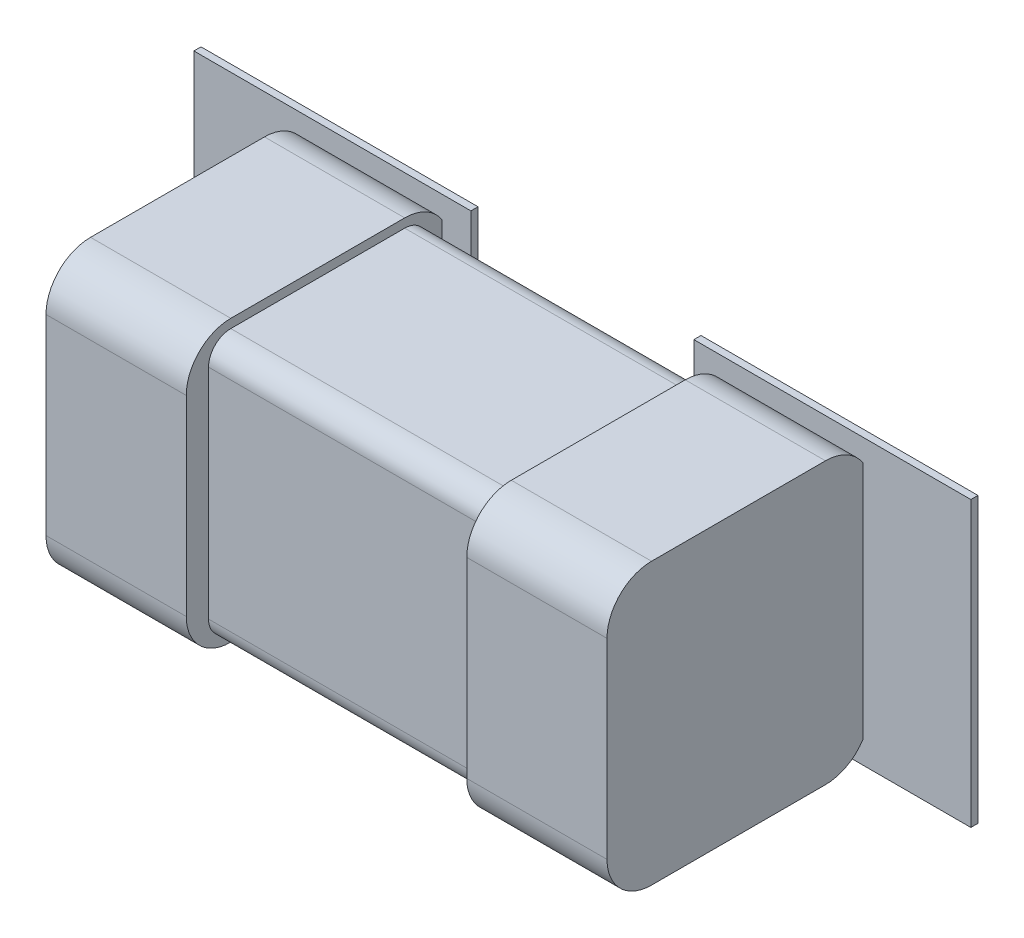
ISO-10303-21;
HEADER;
FILE_DESCRIPTION(('STEP AP214'),'2;1');
FILE_NAME('part.step','',(''),(''),'','','');
FILE_SCHEMA(('AUTOMOTIVE_DESIGN { 1 0 10303 214 1 1 1 1 }'));
ENDSEC;
DATA;
#1=APPLICATION_CONTEXT('core data for automotive mechanical design processes');
#2=APPLICATION_PROTOCOL_DEFINITION('international standard','automotive_design',2000,#1);
#3=PRODUCT_CONTEXT('',#1,'mechanical');
#4=PRODUCT('Part','Part','',(#3));
#5=PRODUCT_RELATED_PRODUCT_CATEGORY('part','',(#4));
#6=PRODUCT_DEFINITION_FORMATION('','',#4);
#7=PRODUCT_DEFINITION_CONTEXT('part definition',#1,'design');
#8=PRODUCT_DEFINITION('design','',#6,#7);
#9=PRODUCT_DEFINITION_SHAPE('','',#8);
#10=(LENGTH_UNIT() NAMED_UNIT(*) SI_UNIT(.MILLI.,.METRE.));
#11=(NAMED_UNIT(*) PLANE_ANGLE_UNIT() SI_UNIT($,.RADIAN.));
#12=(NAMED_UNIT(*) SI_UNIT($,.STERADIAN.) SOLID_ANGLE_UNIT());
#13=UNCERTAINTY_MEASURE_WITH_UNIT(LENGTH_MEASURE(1.E-05),#10,'distance_accuracy_value','');
#14=(GEOMETRIC_REPRESENTATION_CONTEXT(3) GLOBAL_UNCERTAINTY_ASSIGNED_CONTEXT((#13)) GLOBAL_UNIT_ASSIGNED_CONTEXT((#10,
#11,#12)) REPRESENTATION_CONTEXT('',''));
#15=CARTESIAN_POINT('',(0.,0.,0.));
#16=DIRECTION('',(0.,0.,1.));
#17=DIRECTION('',(1.,0.,0.));
#18=AXIS2_PLACEMENT_3D('',#15,#16,#17);
#19=CARTESIAN_POINT('',(0.,0.,0.0762));
#20=DIRECTION('',(0.,0.,1.));
#21=DIRECTION('',(1.,0.,0.));
#22=AXIS2_PLACEMENT_3D('',#19,#20,#21);
#23=PLANE('',#22);
#24=DIRECTION('',(0.,1.,0.));
#25=VECTOR('',#24,1.);
#26=CARTESIAN_POINT('',(-0.318008,-0.405003,0.0762));
#27=LINE('',#26,#25);
#28=CARTESIAN_POINT('',(-0.318008,-0.405003,0.0762));
#29=VERTEX_POINT('',#28);
#30=CARTESIAN_POINT('',(-0.318008,0.405003,0.0762));
#31=VERTEX_POINT('',#30);
#32=EDGE_CURVE('E283',#29,#31,#27,.T.);
#33=ORIENTED_EDGE('',*,*,#32,.F.);
#34=DIRECTION('',(1.,0.,0.));
#35=VECTOR('',#34,1.);
#36=CARTESIAN_POINT('',(-1.1079988,-0.405003,0.0762));
#37=LINE('',#36,#35);
#38=CARTESIAN_POINT('',(-1.1079988,-0.405003,0.0762));
#39=VERTEX_POINT('',#38);
#40=EDGE_CURVE('E288',#39,#29,#37,.T.);
#41=ORIENTED_EDGE('',*,*,#40,.F.);
#42=DIRECTION('',(0.,1.,0.));
#43=VECTOR('',#42,1.);
#44=CARTESIAN_POINT('',(-1.1079988,0.405003,0.0762));
#45=LINE('',#44,#43);
#46=CARTESIAN_POINT('',(-1.1079988,0.405003,0.0762));
#47=VERTEX_POINT('',#46);
#48=EDGE_CURVE('E260',#47,#39,#45,.F.);
#49=ORIENTED_EDGE('',*,*,#48,.F.);
#50=DIRECTION('',(1.,0.,0.));
#51=VECTOR('',#50,1.);
#52=CARTESIAN_POINT('',(-0.318008,0.405003,0.0762));
#53=LINE('',#52,#51);
#54=EDGE_CURVE('E278',#31,#47,#53,.F.);
#55=ORIENTED_EDGE('',*,*,#54,.F.);
#56=EDGE_LOOP('',(#33,#41,#49,#55));
#57=FACE_BOUND('',#56,.T.);
#58=ADVANCED_FACE('F17',(#57),#23,.F.);
#59=CARTESIAN_POINT('',(-1.1079988,-0.405003,0.0762));
#60=DIRECTION('',(0.,-1.,0.));
#61=DIRECTION('',(0.,0.,-1.));
#62=AXIS2_PLACEMENT_3D('',#59,#60,#61);
#63=PLANE('',#62);
#64=DIRECTION('',(0.,0.,1.));
#65=VECTOR('',#64,1.);
#66=CARTESIAN_POINT('',(-1.1079988,-0.405003,0.0762));
#67=LINE('',#66,#65);
#68=CARTESIAN_POINT('',(-1.1079988,-0.405003,0.09652));
#69=VERTEX_POINT('',#68);
#70=EDGE_CURVE('E276',#39,#69,#67,.T.);
#71=ORIENTED_EDGE('',*,*,#70,.F.);
#72=ORIENTED_EDGE('',*,*,#40,.T.);
#73=DIRECTION('',(0.,0.,-1.));
#74=VECTOR('',#73,1.);
#75=CARTESIAN_POINT('',(-0.318008,-0.405003,0.0762));
#76=LINE('',#75,#74);
#77=CARTESIAN_POINT('',(-0.318008,-0.405003,0.09652));
#78=VERTEX_POINT('',#77);
#79=EDGE_CURVE('E285',#78,#29,#76,.T.);
#80=ORIENTED_EDGE('',*,*,#79,.F.);
#81=DIRECTION('',(1.,0.,0.));
#82=VECTOR('',#81,1.);
#83=CARTESIAN_POINT('',(0.,-0.405003,0.09652));
#84=LINE('',#83,#82);
#85=EDGE_CURVE('E259',#69,#78,#84,.T.);
#86=ORIENTED_EDGE('',*,*,#85,.F.);
#87=EDGE_LOOP('',(#71,#72,#80,#86));
#88=FACE_BOUND('',#87,.T.);
#89=ADVANCED_FACE('F916',(#88),#63,.T.);
#90=CARTESIAN_POINT('',(-0.318008,-0.405003,0.0762));
#91=DIRECTION('',(1.,0.,0.));
#92=DIRECTION('',(0.,0.,-1.));
#93=AXIS2_PLACEMENT_3D('',#90,#91,#92);
#94=PLANE('',#93);
#95=ORIENTED_EDGE('',*,*,#79,.T.);
#96=ORIENTED_EDGE('',*,*,#32,.T.);
#97=DIRECTION('',(0.,0.,1.));
#98=VECTOR('',#97,1.);
#99=CARTESIAN_POINT('',(-0.318008,0.405003,0.0762));
#100=LINE('',#99,#98);
#101=CARTESIAN_POINT('',(-0.318008,0.405003,0.09652));
#102=VERTEX_POINT('',#101);
#103=EDGE_CURVE('E280',#102,#31,#100,.F.);
#104=ORIENTED_EDGE('',*,*,#103,.F.);
#105=DIRECTION('',(0.,1.,0.));
#106=VECTOR('',#105,1.);
#107=CARTESIAN_POINT('',(-0.318008,0.,0.09652));
#108=LINE('',#107,#106);
#109=EDGE_CURVE('E257',#78,#102,#108,.T.);
#110=ORIENTED_EDGE('',*,*,#109,.F.);
#111=EDGE_LOOP('',(#95,#96,#104,#110));
#112=FACE_BOUND('',#111,.T.);
#113=ADVANCED_FACE('F907',(#112),#94,.T.);
#114=CARTESIAN_POINT('',(-0.318008,0.405003,0.0762));
#115=DIRECTION('',(0.,1.,0.));
#116=DIRECTION('',(0.,0.,1.));
#117=AXIS2_PLACEMENT_3D('',#114,#115,#116);
#118=PLANE('',#117);
#119=ORIENTED_EDGE('',*,*,#103,.T.);
#120=ORIENTED_EDGE('',*,*,#54,.T.);
#121=DIRECTION('',(0.,0.,1.));
#122=VECTOR('',#121,1.);
#123=CARTESIAN_POINT('',(-1.1079988,0.405003,0.0762));
#124=LINE('',#123,#122);
#125=CARTESIAN_POINT('',(-1.1079988,0.405003,0.09652));
#126=VERTEX_POINT('',#125);
#127=EDGE_CURVE('E273',#126,#47,#124,.F.);
#128=ORIENTED_EDGE('',*,*,#127,.F.);
#129=DIRECTION('',(1.,0.,0.));
#130=VECTOR('',#129,1.);
#131=CARTESIAN_POINT('',(0.,0.405003,0.09652));
#132=LINE('',#131,#130);
#133=EDGE_CURVE('E255',#102,#126,#132,.F.);
#134=ORIENTED_EDGE('',*,*,#133,.F.);
#135=EDGE_LOOP('',(#119,#120,#128,#134));
#136=FACE_BOUND('',#135,.T.);
#137=ADVANCED_FACE('F898',(#136),#118,.T.);
#138=CARTESIAN_POINT('',(-1.1079988,0.405003,0.0762));
#139=DIRECTION('',(-1.,0.,0.));
#140=DIRECTION('',(0.,0.,1.));
#141=AXIS2_PLACEMENT_3D('',#138,#139,#140);
#142=PLANE('',#141);
#143=ORIENTED_EDGE('',*,*,#127,.T.);
#144=ORIENTED_EDGE('',*,*,#48,.T.);
#145=ORIENTED_EDGE('',*,*,#70,.T.);
#146=DIRECTION('',(0.,1.,0.));
#147=VECTOR('',#146,1.);
#148=CARTESIAN_POINT('',(-1.1079988,0.,0.09652));
#149=LINE('',#148,#147);
#150=EDGE_CURVE('E238',#126,#69,#149,.F.);
#151=ORIENTED_EDGE('',*,*,#150,.F.);
#152=EDGE_LOOP('',(#143,#144,#145,#151));
#153=FACE_BOUND('',#152,.T.);
#154=ADVANCED_FACE('F889',(#153),#142,.T.);
#155=CARTESIAN_POINT('',(-0.800000000000102,0.399999999999924,0.0762));
#156=DIRECTION('',(-1.,0.,0.));
#157=DIRECTION('',(0.,0.,1.));
#158=AXIS2_PLACEMENT_3D('',#155,#156,#157);
#159=PLANE('',#158);
#160=CARTESIAN_POINT('',(-0.800000000000102,0.272999999999924,0.2032));
#161=DIRECTION('',(1.,0.,0.));
#162=DIRECTION('',(0.,0.,-1.));
#163=AXIS2_PLACEMENT_3D('',#160,#161,#162);
#164=CIRCLE('',#163,0.127);
#165=CARTESIAN_POINT('',(-0.800000000000102,0.341908472628476,0.0965199999999994));
#166=VERTEX_POINT('',#165);
#167=CARTESIAN_POINT('',(-0.800000000000102,0.399999999999924,0.2032));
#168=VERTEX_POINT('',#167);
#169=EDGE_CURVE('E232',#166,#168,#164,.T.);
#170=ORIENTED_EDGE('',*,*,#169,.F.);
#171=DIRECTION('',(0.,1.,0.));
#172=VECTOR('',#171,1.);
#173=CARTESIAN_POINT('',(-0.800000000000102,0.,0.09652));
#174=LINE('',#173,#172);
#175=CARTESIAN_POINT('',(-0.800000000000102,-0.341908472628476,0.0965199999999994));
#176=VERTEX_POINT('',#175);
#177=EDGE_CURVE('E227',#176,#166,#174,.T.);
#178=ORIENTED_EDGE('',*,*,#177,.F.);
#179=CARTESIAN_POINT('',(-0.800000000000102,-0.272999999999924,0.2032));
#180=DIRECTION('',(1.,0.,0.));
#181=DIRECTION('',(0.,0.,-1.));
#182=AXIS2_PLACEMENT_3D('',#179,#180,#181);
#183=CIRCLE('',#182,0.127);
#184=CARTESIAN_POINT('',(-0.800000000000102,-0.399999999999924,0.2032));
#185=VERTEX_POINT('',#184);
#186=EDGE_CURVE('E20',#185,#176,#183,.T.);
#187=ORIENTED_EDGE('',*,*,#186,.F.);
#188=DIRECTION('',(0.,0.,-1.));
#189=VECTOR('',#188,1.);
#190=CARTESIAN_POINT('',(-0.800000000000102,-0.399999999999924,0.0762));
#191=LINE('',#190,#189);
#192=CARTESIAN_POINT('',(-0.800000000000102,-0.399999999999924,0.699262));
#193=VERTEX_POINT('',#192);
#194=EDGE_CURVE('E222',#193,#185,#191,.T.);
#195=ORIENTED_EDGE('',*,*,#194,.F.);
#196=CARTESIAN_POINT('',(-0.800000000000102,-0.272999999999924,0.699262));
#197=DIRECTION('',(1.,0.,0.));
#198=DIRECTION('',(0.,0.,-1.));
#199=AXIS2_PLACEMENT_3D('',#196,#197,#198);
#200=CIRCLE('',#199,0.127);
#201=CARTESIAN_POINT('',(-0.800000000000102,-0.272999999999924,0.826262));
#202=VERTEX_POINT('',#201);
#203=EDGE_CURVE('E369',#202,#193,#200,.T.);
#204=ORIENTED_EDGE('',*,*,#203,.F.);
#205=DIRECTION('',(0.,1.,0.));
#206=VECTOR('',#205,1.);
#207=CARTESIAN_POINT('',(-0.800000000000102,0.,0.826262));
#208=LINE('',#207,#206);
#209=CARTESIAN_POINT('',(-0.800000000000102,0.272999999999924,0.826262));
#210=VERTEX_POINT('',#209);
#211=EDGE_CURVE('E266',#210,#202,#208,.F.);
#212=ORIENTED_EDGE('',*,*,#211,.F.);
#213=CARTESIAN_POINT('',(-0.800000000000102,0.272999999999924,0.699262));
#214=DIRECTION('',(-1.,0.,0.));
#215=DIRECTION('',(0.,0.,1.));
#216=AXIS2_PLACEMENT_3D('',#213,#214,#215);
#217=CIRCLE('',#216,0.127);
#218=CARTESIAN_POINT('',(-0.800000000000102,0.399999999999924,0.699262));
#219=VERTEX_POINT('',#218);
#220=EDGE_CURVE('E265',#219,#210,#217,.F.);
#221=ORIENTED_EDGE('',*,*,#220,.F.);
#222=DIRECTION('',(0.,0.,1.));
#223=VECTOR('',#222,1.);
#224=CARTESIAN_POINT('',(-0.800000000000102,0.399999999999924,0.0762));
#225=LINE('',#224,#223);
#226=EDGE_CURVE('E262',#168,#219,#225,.T.);
#227=ORIENTED_EDGE('',*,*,#226,.F.);
#228=EDGE_LOOP('',(#170,#178,#187,#195,#204,#212,#221,#227));
#229=FACE_BOUND('',#228,.T.);
#230=ADVANCED_FACE('F229',(#229),#159,.T.);
#231=CARTESIAN_POINT('',(0.,0.,0.09652));
#232=DIRECTION('',(0.,0.,1.));
#233=DIRECTION('',(1.,0.,0.));
#234=AXIS2_PLACEMENT_3D('',#231,#232,#233);
#235=PLANE('',#234);
#236=DIRECTION('',(1.,0.,0.));
#237=VECTOR('',#236,1.);
#238=CARTESIAN_POINT('',(0.800000000000102,-0.341908472628475,0.0965199999999988));
#239=LINE('',#238,#237);
#240=CARTESIAN_POINT('',(-0.399999999999924,-0.341908472628476,0.0965199999999994));
#241=VERTEX_POINT('',#240);
#242=EDGE_CURVE('E237',#176,#241,#239,.T.);
#243=ORIENTED_EDGE('',*,*,#242,.F.);
#244=ORIENTED_EDGE('',*,*,#177,.T.);
#245=DIRECTION('',(1.,0.,0.));
#246=VECTOR('',#245,1.);
#247=CARTESIAN_POINT('',(0.800000000000102,0.341908472628475,0.0965199999999988));
#248=LINE('',#247,#246);
#249=CARTESIAN_POINT('',(-0.399999999999924,0.341908472628476,0.0965199999999994));
#250=VERTEX_POINT('',#249);
#251=EDGE_CURVE('E366',#250,#166,#248,.F.);
#252=ORIENTED_EDGE('',*,*,#251,.F.);
#253=DIRECTION('',(0.,1.,0.));
#254=VECTOR('',#253,1.);
#255=CARTESIAN_POINT('',(-0.399999999999924,0.399999999999924,0.09652));
#256=LINE('',#255,#254);
#257=EDGE_CURVE('E248',#250,#241,#256,.F.);
#258=ORIENTED_EDGE('',*,*,#257,.T.);
#259=EDGE_LOOP('',(#243,#244,#252,#258));
#260=FACE_BOUND('',#259,.T.);
#261=ORIENTED_EDGE('',*,*,#133,.T.);
#262=ORIENTED_EDGE('',*,*,#150,.T.);
#263=ORIENTED_EDGE('',*,*,#85,.T.);
#264=ORIENTED_EDGE('',*,*,#109,.T.);
#265=EDGE_LOOP('',(#261,#262,#263,#264));
#266=FACE_BOUND('',#265,.T.);
#267=ADVANCED_FACE('F246',(#260,#266),#235,.T.);
#268=CARTESIAN_POINT('',(0.800000000000102,-0.272999999999924,0.2032));
#269=DIRECTION('',(1.,0.,0.));
#270=DIRECTION('',(0.,0.,-1.));
#271=AXIS2_PLACEMENT_3D('',#268,#269,#270);
#272=CYLINDRICAL_SURFACE('',#271,0.127);
#273=DIRECTION('',(1.,0.,0.));
#274=VECTOR('',#273,1.);
#275=CARTESIAN_POINT('',(-0.800000000000102,-0.399999999999924,0.2032));
#276=LINE('',#275,#274);
#277=CARTESIAN_POINT('',(-0.399999999999924,-0.399999999999924,0.2032));
#278=VERTEX_POINT('',#277);
#279=EDGE_CURVE('E244',#185,#278,#276,.T.);
#280=ORIENTED_EDGE('',*,*,#279,.F.);
#281=ORIENTED_EDGE('',*,*,#186,.T.);
#282=ORIENTED_EDGE('',*,*,#242,.T.);
#283=CARTESIAN_POINT('',(-0.399999999999924,-0.272999999999924,0.2032));
#284=DIRECTION('',(1.,0.,0.));
#285=DIRECTION('',(0.,0.,-1.));
#286=AXIS2_PLACEMENT_3D('',#283,#284,#285);
#287=CIRCLE('',#286,0.127);
#288=EDGE_CURVE('E363',#241,#278,#287,.F.);
#289=ORIENTED_EDGE('',*,*,#288,.T.);
#290=EDGE_LOOP('',(#280,#281,#282,#289));
#291=FACE_BOUND('',#290,.T.);
#292=ADVANCED_FACE('F241',(#291),#272,.T.);
#293=CARTESIAN_POINT('',(-0.800000000000102,-0.399999999999924,0.0762));
#294=DIRECTION('',(0.,-1.,0.));
#295=DIRECTION('',(0.,0.,-1.));
#296=AXIS2_PLACEMENT_3D('',#293,#294,#295);
#297=PLANE('',#296);
#298=ORIENTED_EDGE('',*,*,#194,.T.);
#299=ORIENTED_EDGE('',*,*,#279,.T.);
#300=DIRECTION('',(0.,0.,1.));
#301=VECTOR('',#300,1.);
#302=CARTESIAN_POINT('',(-0.399999999999924,-0.399999999999924,0.826262));
#303=LINE('',#302,#301);
#304=CARTESIAN_POINT('',(-0.399999999999924,-0.399999999999924,0.699262));
#305=VERTEX_POINT('',#304);
#306=EDGE_CURVE('E362',#278,#305,#303,.T.);
#307=ORIENTED_EDGE('',*,*,#306,.T.);
#308=DIRECTION('',(1.,0.,0.));
#309=VECTOR('',#308,1.);
#310=CARTESIAN_POINT('',(-0.803806762096494,-0.399999999999924,0.699262));
#311=LINE('',#310,#309);
#312=EDGE_CURVE('E269',#193,#305,#311,.T.);
#313=ORIENTED_EDGE('',*,*,#312,.F.);
#314=EDGE_LOOP('',(#298,#299,#307,#313));
#315=FACE_BOUND('',#314,.T.);
#316=ADVANCED_FACE('F375',(#315),#297,.T.);
#317=CARTESIAN_POINT('',(-0.803806762096494,-0.272999999999924,0.699262));
#318=DIRECTION('',(1.,0.,0.));
#319=DIRECTION('',(0.,0.,-1.));
#320=AXIS2_PLACEMENT_3D('',#317,#318,#319);
#321=CYLINDRICAL_SURFACE('',#320,0.127);
#322=ORIENTED_EDGE('',*,*,#312,.T.);
#323=CARTESIAN_POINT('',(-0.399999999999924,-0.272999999999924,0.699262));
#324=DIRECTION('',(1.,0.,0.));
#325=DIRECTION('',(0.,0.,-1.));
#326=AXIS2_PLACEMENT_3D('',#323,#324,#325);
#327=CIRCLE('',#326,0.127);
#328=CARTESIAN_POINT('',(-0.399999999999924,-0.272999999999924,0.826262));
#329=VERTEX_POINT('',#328);
#330=EDGE_CURVE('E359',#305,#329,#327,.F.);
#331=ORIENTED_EDGE('',*,*,#330,.T.);
#332=DIRECTION('',(1.,0.,0.));
#333=VECTOR('',#332,1.);
#334=CARTESIAN_POINT('',(0.,-0.272999999999924,0.826262));
#335=LINE('',#334,#333);
#336=EDGE_CURVE('E268',#202,#329,#335,.T.);
#337=ORIENTED_EDGE('',*,*,#336,.F.);
#338=ORIENTED_EDGE('',*,*,#203,.T.);
#339=EDGE_LOOP('',(#322,#331,#337,#338));
#340=FACE_BOUND('',#339,.T.);
#341=ADVANCED_FACE('F402',(#340),#321,.T.);
#342=CARTESIAN_POINT('',(0.,0.,0.826262));
#343=DIRECTION('',(0.,0.,1.));
#344=DIRECTION('',(1.,0.,0.));
#345=AXIS2_PLACEMENT_3D('',#342,#343,#344);
#346=PLANE('',#345);
#347=DIRECTION('',(0.,1.,0.));
#348=VECTOR('',#347,1.);
#349=CARTESIAN_POINT('',(-0.399999999999924,0.399999999999924,0.826262));
#350=LINE('',#349,#348);
#351=CARTESIAN_POINT('',(-0.399999999999924,0.272999999999924,0.826262));
#352=VERTEX_POINT('',#351);
#353=EDGE_CURVE('E358',#329,#352,#350,.T.);
#354=ORIENTED_EDGE('',*,*,#353,.T.);
#355=DIRECTION('',(-1.,0.,0.));
#356=VECTOR('',#355,1.);
#357=CARTESIAN_POINT('',(0.80366030246536,0.272999999999924,0.826262));
#358=LINE('',#357,#356);
#359=EDGE_CURVE('E368',#210,#352,#358,.F.);
#360=ORIENTED_EDGE('',*,*,#359,.F.);
#361=ORIENTED_EDGE('',*,*,#211,.T.);
#362=ORIENTED_EDGE('',*,*,#336,.T.);
#363=EDGE_LOOP('',(#354,#360,#361,#362));
#364=FACE_BOUND('',#363,.T.);
#365=ADVANCED_FACE('F399',(#364),#346,.T.);
#366=CARTESIAN_POINT('',(0.80366030246536,0.272999999999924,0.699262));
#367=DIRECTION('',(-1.,0.,0.));
#368=DIRECTION('',(0.,0.,1.));
#369=AXIS2_PLACEMENT_3D('',#366,#367,#368);
#370=CYLINDRICAL_SURFACE('',#369,0.127);
#371=DIRECTION('',(1.,0.,0.));
#372=VECTOR('',#371,1.);
#373=CARTESIAN_POINT('',(0.800000000000102,0.399999999999924,0.699262));
#374=LINE('',#373,#372);
#375=CARTESIAN_POINT('',(-0.399999999999924,0.399999999999924,0.699262));
#376=VERTEX_POINT('',#375);
#377=EDGE_CURVE('E264',#219,#376,#374,.T.);
#378=ORIENTED_EDGE('',*,*,#377,.F.);
#379=ORIENTED_EDGE('',*,*,#220,.T.);
#380=ORIENTED_EDGE('',*,*,#359,.T.);
#381=CARTESIAN_POINT('',(-0.399999999999924,0.272999999999924,0.699262));
#382=DIRECTION('',(-1.,0.,0.));
#383=DIRECTION('',(0.,0.,1.));
#384=AXIS2_PLACEMENT_3D('',#381,#382,#383);
#385=CIRCLE('',#384,0.127);
#386=EDGE_CURVE('E355',#352,#376,#385,.T.);
#387=ORIENTED_EDGE('',*,*,#386,.T.);
#388=EDGE_LOOP('',(#378,#379,#380,#387));
#389=FACE_BOUND('',#388,.T.);
#390=ADVANCED_FACE('F410',(#389),#370,.T.);
#391=CARTESIAN_POINT('',(0.800000000000102,0.399999999999924,0.0762));
#392=DIRECTION('',(0.,1.,0.));
#393=DIRECTION('',(0.,0.,1.));
#394=AXIS2_PLACEMENT_3D('',#391,#392,#393);
#395=PLANE('',#394);
#396=DIRECTION('',(0.,0.,1.));
#397=VECTOR('',#396,1.);
#398=CARTESIAN_POINT('',(-0.399999999999924,0.399999999999924,0.826262));
#399=LINE('',#398,#397);
#400=CARTESIAN_POINT('',(-0.399999999999924,0.399999999999924,0.2032));
#401=VERTEX_POINT('',#400);
#402=EDGE_CURVE('E354',#376,#401,#399,.F.);
#403=ORIENTED_EDGE('',*,*,#402,.T.);
#404=DIRECTION('',(1.,0.,0.));
#405=VECTOR('',#404,1.);
#406=CARTESIAN_POINT('',(0.800000000000102,0.399999999999924,0.2032));
#407=LINE('',#406,#405);
#408=EDGE_CURVE('E392',#168,#401,#407,.T.);
#409=ORIENTED_EDGE('',*,*,#408,.F.);
#410=ORIENTED_EDGE('',*,*,#226,.T.);
#411=ORIENTED_EDGE('',*,*,#377,.T.);
#412=EDGE_LOOP('',(#403,#409,#410,#411));
#413=FACE_BOUND('',#412,.T.);
#414=ADVANCED_FACE('F514',(#413),#395,.T.);
#415=CARTESIAN_POINT('',(0.800000000000102,0.272999999999924,0.2032));
#416=DIRECTION('',(1.,0.,0.));
#417=DIRECTION('',(0.,0.,-1.));
#418=AXIS2_PLACEMENT_3D('',#415,#416,#417);
#419=CYLINDRICAL_SURFACE('',#418,0.127);
#420=ORIENTED_EDGE('',*,*,#251,.T.);
#421=ORIENTED_EDGE('',*,*,#169,.T.);
#422=ORIENTED_EDGE('',*,*,#408,.T.);
#423=CARTESIAN_POINT('',(-0.399999999999924,0.272999999999924,0.2032));
#424=DIRECTION('',(1.,0.,0.));
#425=DIRECTION('',(0.,0.,-1.));
#426=AXIS2_PLACEMENT_3D('',#423,#424,#425);
#427=CIRCLE('',#426,0.127);
#428=EDGE_CURVE('E351',#401,#250,#427,.F.);
#429=ORIENTED_EDGE('',*,*,#428,.T.);
#430=EDGE_LOOP('',(#420,#421,#422,#429));
#431=FACE_BOUND('',#430,.T.);
#432=ADVANCED_FACE('F510',(#431),#419,.T.);
#433=CARTESIAN_POINT('',(-0.399999999999924,0.399999999999924,0.826262));
#434=DIRECTION('',(-1.,0.,0.));
#435=DIRECTION('',(0.,0.,1.));
#436=AXIS2_PLACEMENT_3D('',#433,#434,#435);
#437=PLANE('',#436);
#438=DIRECTION('',(0.,1.,0.));
#439=VECTOR('',#438,1.);
#440=CARTESIAN_POINT('',(-0.399999999999924,0.374599999999924,0.1397));
#441=LINE('',#440,#439);
#442=CARTESIAN_POINT('',(-0.399999999999924,0.311099999999924,0.1397));
#443=VERTEX_POINT('',#442);
#444=CARTESIAN_POINT('',(-0.399999999999924,-0.311099999999924,0.1397));
#445=VERTEX_POINT('',#444);
#446=EDGE_CURVE('E342',#443,#445,#441,.F.);
#447=ORIENTED_EDGE('',*,*,#446,.T.);
#448=CARTESIAN_POINT('',(-0.399999999999924,-0.311099999999924,0.2032));
#449=DIRECTION('',(1.,0.,0.));
#450=DIRECTION('',(0.,0.,-1.));
#451=AXIS2_PLACEMENT_3D('',#448,#449,#450);
#452=CIRCLE('',#451,0.0635);
#453=CARTESIAN_POINT('',(-0.399999999999924,-0.374599999999924,0.2032));
#454=VERTEX_POINT('',#453);
#455=EDGE_CURVE('E339',#454,#445,#452,.T.);
#456=ORIENTED_EDGE('',*,*,#455,.F.);
#457=DIRECTION('',(0.,0.,1.));
#458=VECTOR('',#457,1.);
#459=CARTESIAN_POINT('',(-0.399999999999924,-0.374599999999924,0.826262));
#460=LINE('',#459,#458);
#461=CARTESIAN_POINT('',(-0.399999999999924,-0.374599999999924,0.699262));
#462=VERTEX_POINT('',#461);
#463=EDGE_CURVE('E338',#454,#462,#460,.T.);
#464=ORIENTED_EDGE('',*,*,#463,.T.);
#465=CARTESIAN_POINT('',(-0.399999999999924,-0.311099999999924,0.699262));
#466=DIRECTION('',(-1.,0.,0.));
#467=DIRECTION('',(0.,0.,1.));
#468=AXIS2_PLACEMENT_3D('',#465,#466,#467);
#469=CIRCLE('',#468,0.0635);
#470=CARTESIAN_POINT('',(-0.399999999999924,-0.311099999999924,0.762762));
#471=VERTEX_POINT('',#470);
#472=EDGE_CURVE('E335',#471,#462,#469,.F.);
#473=ORIENTED_EDGE('',*,*,#472,.F.);
#474=DIRECTION('',(0.,1.,0.));
#475=VECTOR('',#474,1.);
#476=CARTESIAN_POINT('',(-0.399999999999924,0.374599999999924,0.762762));
#477=LINE('',#476,#475);
#478=CARTESIAN_POINT('',(-0.399999999999924,0.311099999999924,0.762762));
#479=VERTEX_POINT('',#478);
#480=EDGE_CURVE('E350',#471,#479,#477,.T.);
#481=ORIENTED_EDGE('',*,*,#480,.T.);
#482=CARTESIAN_POINT('',(-0.399999999999924,0.311099999999924,0.699262));
#483=DIRECTION('',(1.,0.,0.));
#484=DIRECTION('',(0.,0.,-1.));
#485=AXIS2_PLACEMENT_3D('',#482,#483,#484);
#486=CIRCLE('',#485,0.0635);
#487=CARTESIAN_POINT('',(-0.399999999999924,0.374599999999924,0.699262));
#488=VERTEX_POINT('',#487);
#489=EDGE_CURVE('E347',#488,#479,#486,.T.);
#490=ORIENTED_EDGE('',*,*,#489,.F.);
#491=DIRECTION('',(0.,0.,-1.));
#492=VECTOR('',#491,1.);
#493=CARTESIAN_POINT('',(-0.399999999999924,0.374599999999924,0.826262));
#494=LINE('',#493,#492);
#495=CARTESIAN_POINT('',(-0.399999999999924,0.374599999999924,0.2032));
#496=VERTEX_POINT('',#495);
#497=EDGE_CURVE('E346',#488,#496,#494,.T.);
#498=ORIENTED_EDGE('',*,*,#497,.T.);
#499=CARTESIAN_POINT('',(-0.399999999999924,0.311099999999924,0.2032));
#500=DIRECTION('',(-1.,0.,0.));
#501=DIRECTION('',(0.,0.,1.));
#502=AXIS2_PLACEMENT_3D('',#499,#500,#501);
#503=CIRCLE('',#502,0.0635);
#504=EDGE_CURVE('E343',#443,#496,#503,.F.);
#505=ORIENTED_EDGE('',*,*,#504,.F.);
#506=EDGE_LOOP('',(#447,#456,#464,#473,#481,#490,#498,#505));
#507=FACE_BOUND('',#506,.T.);
#508=ORIENTED_EDGE('',*,*,#402,.F.);
#509=ORIENTED_EDGE('',*,*,#386,.F.);
#510=ORIENTED_EDGE('',*,*,#353,.F.);
#511=ORIENTED_EDGE('',*,*,#330,.F.);
#512=ORIENTED_EDGE('',*,*,#306,.F.);
#513=ORIENTED_EDGE('',*,*,#288,.F.);
#514=ORIENTED_EDGE('',*,*,#257,.F.);
#515=ORIENTED_EDGE('',*,*,#428,.F.);
#516=EDGE_LOOP('',(#508,#509,#510,#511,#512,#513,#514,#515));
#517=FACE_BOUND('',#516,.T.);
#518=ADVANCED_FACE('F379',(#507,#517),#437,.F.);
#519=CARTESIAN_POINT('',(0.399999999999924,0.374599999999924,0.762762));
#520=DIRECTION('',(0.,0.,-1.));
#521=DIRECTION('',(-1.,0.,0.));
#522=AXIS2_PLACEMENT_3D('',#519,#520,#521);
#523=PLANE('',#522);
#524=DIRECTION('',(-1.,0.,0.));
#525=VECTOR('',#524,1.);
#526=CARTESIAN_POINT('',(0.40380676209657,-0.311099999999924,0.762762));
#527=LINE('',#526,#525);
#528=CARTESIAN_POINT('',(0.399999999999924,-0.311099999999924,0.762762));
#529=VERTEX_POINT('',#528);
#530=EDGE_CURVE('E543',#529,#471,#527,.T.);
#531=ORIENTED_EDGE('',*,*,#530,.F.);
#532=DIRECTION('',(0.,1.,0.));
#533=VECTOR('',#532,1.);
#534=CARTESIAN_POINT('',(0.399999999999924,0.374599999999924,0.762762));
#535=LINE('',#534,#533);
#536=CARTESIAN_POINT('',(0.399999999999924,0.311099999999924,0.762762));
#537=VERTEX_POINT('',#536);
#538=EDGE_CURVE('E322',#529,#537,#535,.T.);
#539=ORIENTED_EDGE('',*,*,#538,.T.);
#540=DIRECTION('',(1.,0.,0.));
#541=VECTOR('',#540,1.);
#542=CARTESIAN_POINT('',(-0.403990356522624,0.311099999999924,0.762762));
#543=LINE('',#542,#541);
#544=EDGE_CURVE('E349',#479,#537,#543,.T.);
#545=ORIENTED_EDGE('',*,*,#544,.F.);
#546=ORIENTED_EDGE('',*,*,#480,.F.);
#547=EDGE_LOOP('',(#531,#539,#545,#546));
#548=FACE_BOUND('',#547,.T.);
#549=ADVANCED_FACE('F503',(#548),#523,.F.);
#550=CARTESIAN_POINT('',(-0.403990356522624,0.311099999999924,0.699262));
#551=DIRECTION('',(1.,0.,0.));
#552=DIRECTION('',(0.,0.,-1.));
#553=AXIS2_PLACEMENT_3D('',#550,#551,#552);
#554=CYLINDRICAL_SURFACE('',#553,0.0635);
#555=ORIENTED_EDGE('',*,*,#489,.T.);
#556=ORIENTED_EDGE('',*,*,#544,.T.);
#557=CARTESIAN_POINT('',(0.399999999999924,0.311099999999924,0.699262));
#558=DIRECTION('',(1.,0.,0.));
#559=DIRECTION('',(0.,0.,-1.));
#560=AXIS2_PLACEMENT_3D('',#557,#558,#559);
#561=CIRCLE('',#560,0.0635);
#562=CARTESIAN_POINT('',(0.399999999999924,0.374599999999924,0.699262));
#563=VERTEX_POINT('',#562);
#564=EDGE_CURVE('E319',#537,#563,#561,.F.);
#565=ORIENTED_EDGE('',*,*,#564,.T.);
#566=DIRECTION('',(1.,0.,0.));
#567=VECTOR('',#566,1.);
#568=CARTESIAN_POINT('',(-0.399999999999924,0.374599999999924,0.699262));
#569=LINE('',#568,#567);
#570=EDGE_CURVE('E391',#563,#488,#569,.F.);
#571=ORIENTED_EDGE('',*,*,#570,.T.);
#572=EDGE_LOOP('',(#555,#556,#565,#571));
#573=FACE_BOUND('',#572,.T.);
#574=ADVANCED_FACE('F499',(#573),#554,.T.);
#575=CARTESIAN_POINT('',(-0.399999999999924,0.374599999999924,0.826262));
#576=DIRECTION('',(0.,-1.,0.));
#577=DIRECTION('',(0.,0.,-1.));
#578=AXIS2_PLACEMENT_3D('',#575,#576,#577);
#579=PLANE('',#578);
#580=ORIENTED_EDGE('',*,*,#570,.F.);
#581=DIRECTION('',(0.,0.,-1.));
#582=VECTOR('',#581,1.);
#583=CARTESIAN_POINT('',(0.399999999999924,0.374599999999924,0.826262));
#584=LINE('',#583,#582);
#585=CARTESIAN_POINT('',(0.399999999999924,0.374599999999924,0.2032));
#586=VERTEX_POINT('',#585);
#587=EDGE_CURVE('E318',#563,#586,#584,.T.);
#588=ORIENTED_EDGE('',*,*,#587,.T.);
#589=DIRECTION('',(-1.,0.,0.));
#590=VECTOR('',#589,1.);
#591=CARTESIAN_POINT('',(0.403660302465436,0.374599999999924,0.2032));
#592=LINE('',#591,#590);
#593=EDGE_CURVE('E345',#496,#586,#592,.F.);
#594=ORIENTED_EDGE('',*,*,#593,.F.);
#595=ORIENTED_EDGE('',*,*,#497,.F.);
#596=EDGE_LOOP('',(#580,#588,#594,#595));
#597=FACE_BOUND('',#596,.T.);
#598=ADVANCED_FACE('F495',(#597),#579,.F.);
#599=CARTESIAN_POINT('',(0.403660302465436,0.311099999999924,0.2032));
#600=DIRECTION('',(-1.,0.,0.));
#601=DIRECTION('',(0.,0.,1.));
#602=AXIS2_PLACEMENT_3D('',#599,#600,#601);
#603=CYLINDRICAL_SURFACE('',#602,0.0635);
#604=CARTESIAN_POINT('',(0.399999999999924,0.311099999999924,0.2032));
#605=DIRECTION('',(-1.,0.,0.));
#606=DIRECTION('',(0.,0.,1.));
#607=AXIS2_PLACEMENT_3D('',#604,#605,#606);
#608=CIRCLE('',#607,0.0635);
#609=CARTESIAN_POINT('',(0.399999999999924,0.311099999999924,0.1397));
#610=VERTEX_POINT('',#609);
#611=EDGE_CURVE('E315',#586,#610,#608,.T.);
#612=ORIENTED_EDGE('',*,*,#611,.T.);
#613=DIRECTION('',(1.,0.,0.));
#614=VECTOR('',#613,1.);
#615=CARTESIAN_POINT('',(-0.399999999999924,0.311099999999924,0.1397));
#616=LINE('',#615,#614);
#617=EDGE_CURVE('E388',#610,#443,#616,.F.);
#618=ORIENTED_EDGE('',*,*,#617,.T.);
#619=ORIENTED_EDGE('',*,*,#504,.T.);
#620=ORIENTED_EDGE('',*,*,#593,.T.);
#621=EDGE_LOOP('',(#612,#618,#619,#620));
#622=FACE_BOUND('',#621,.T.);
#623=ADVANCED_FACE('F491',(#622),#603,.T.);
#624=CARTESIAN_POINT('',(-0.399999999999924,0.374599999999924,0.1397));
#625=DIRECTION('',(0.,0.,1.));
#626=DIRECTION('',(1.,0.,0.));
#627=AXIS2_PLACEMENT_3D('',#624,#625,#626);
#628=PLANE('',#627);
#629=DIRECTION('',(1.,0.,0.));
#630=VECTOR('',#629,1.);
#631=CARTESIAN_POINT('',(-0.403660302465436,-0.311099999999924,0.1397));
#632=LINE('',#631,#630);
#633=CARTESIAN_POINT('',(0.399999999999924,-0.311099999999924,0.1397));
#634=VERTEX_POINT('',#633);
#635=EDGE_CURVE('E341',#445,#634,#632,.T.);
#636=ORIENTED_EDGE('',*,*,#635,.F.);
#637=ORIENTED_EDGE('',*,*,#446,.F.);
#638=ORIENTED_EDGE('',*,*,#617,.F.);
#639=DIRECTION('',(0.,1.,0.));
#640=VECTOR('',#639,1.);
#641=CARTESIAN_POINT('',(0.399999999999924,0.374599999999924,0.1397));
#642=LINE('',#641,#640);
#643=EDGE_CURVE('E314',#610,#634,#642,.F.);
#644=ORIENTED_EDGE('',*,*,#643,.T.);
#645=EDGE_LOOP('',(#636,#637,#638,#644));
#646=FACE_BOUND('',#645,.T.);
#647=ADVANCED_FACE('F487',(#646),#628,.F.);
#648=CARTESIAN_POINT('',(-0.403660302465436,-0.311099999999924,0.2032));
#649=DIRECTION('',(1.,0.,0.));
#650=DIRECTION('',(0.,0.,-1.));
#651=AXIS2_PLACEMENT_3D('',#648,#649,#650);
#652=CYLINDRICAL_SURFACE('',#651,0.0635);
#653=ORIENTED_EDGE('',*,*,#455,.T.);
#654=ORIENTED_EDGE('',*,*,#635,.T.);
#655=CARTESIAN_POINT('',(0.399999999999924,-0.311099999999924,0.2032));
#656=DIRECTION('',(1.,0.,0.));
#657=DIRECTION('',(0.,0.,-1.));
#658=AXIS2_PLACEMENT_3D('',#655,#656,#657);
#659=CIRCLE('',#658,0.0635);
#660=CARTESIAN_POINT('',(0.399999999999924,-0.374599999999924,0.2032));
#661=VERTEX_POINT('',#660);
#662=EDGE_CURVE('E311',#634,#661,#659,.F.);
#663=ORIENTED_EDGE('',*,*,#662,.T.);
#664=DIRECTION('',(1.,0.,0.));
#665=VECTOR('',#664,1.);
#666=CARTESIAN_POINT('',(0.399999999999924,-0.374599999999924,0.2032));
#667=LINE('',#666,#665);
#668=EDGE_CURVE('E531',#661,#454,#667,.F.);
#669=ORIENTED_EDGE('',*,*,#668,.T.);
#670=EDGE_LOOP('',(#653,#654,#663,#669));
#671=FACE_BOUND('',#670,.T.);
#672=ADVANCED_FACE('F483',(#671),#652,.T.);
#673=CARTESIAN_POINT('',(0.399999999999924,-0.374599999999924,0.826262));
#674=DIRECTION('',(0.,1.,0.));
#675=DIRECTION('',(0.,0.,1.));
#676=AXIS2_PLACEMENT_3D('',#673,#674,#675);
#677=PLANE('',#676);
#678=ORIENTED_EDGE('',*,*,#668,.F.);
#679=DIRECTION('',(0.,0.,-1.));
#680=VECTOR('',#679,1.);
#681=CARTESIAN_POINT('',(0.399999999999924,-0.374599999999924,0.826262));
#682=LINE('',#681,#680);
#683=CARTESIAN_POINT('',(0.399999999999924,-0.374599999999924,0.699262));
#684=VERTEX_POINT('',#683);
#685=EDGE_CURVE('E310',#661,#684,#682,.F.);
#686=ORIENTED_EDGE('',*,*,#685,.T.);
#687=DIRECTION('',(-1.,0.,0.));
#688=VECTOR('',#687,1.);
#689=CARTESIAN_POINT('',(0.40380676209657,-0.374599999999924,0.699262));
#690=LINE('',#689,#688);
#691=EDGE_CURVE('E337',#462,#684,#690,.F.);
#692=ORIENTED_EDGE('',*,*,#691,.F.);
#693=ORIENTED_EDGE('',*,*,#463,.F.);
#694=EDGE_LOOP('',(#678,#686,#692,#693));
#695=FACE_BOUND('',#694,.T.);
#696=ADVANCED_FACE('F479',(#695),#677,.F.);
#697=CARTESIAN_POINT('',(0.40380676209657,-0.311099999999924,0.699262));
#698=DIRECTION('',(-1.,0.,0.));
#699=DIRECTION('',(0.,0.,1.));
#700=AXIS2_PLACEMENT_3D('',#697,#698,#699);
#701=CYLINDRICAL_SURFACE('',#700,0.0635);
#702=CARTESIAN_POINT('',(0.399999999999924,-0.311099999999924,0.699262));
#703=DIRECTION('',(-1.,0.,0.));
#704=DIRECTION('',(0.,0.,1.));
#705=AXIS2_PLACEMENT_3D('',#702,#703,#704);
#706=CIRCLE('',#705,0.0635);
#707=EDGE_CURVE('E307',#684,#529,#706,.T.);
#708=ORIENTED_EDGE('',*,*,#707,.T.);
#709=ORIENTED_EDGE('',*,*,#530,.T.);
#710=ORIENTED_EDGE('',*,*,#472,.T.);
#711=ORIENTED_EDGE('',*,*,#691,.T.);
#712=EDGE_LOOP('',(#708,#709,#710,#711));
#713=FACE_BOUND('',#712,.T.);
#714=ADVANCED_FACE('F475',(#713),#701,.T.);
#715=CARTESIAN_POINT('',(0.800000000000102,0.399999999999924,0.0762));
#716=DIRECTION('',(0.,1.,0.));
#717=DIRECTION('',(0.,0.,1.));
#718=AXIS2_PLACEMENT_3D('',#715,#716,#717);
#719=PLANE('',#718);
#720=DIRECTION('',(0.,0.,-1.));
#721=VECTOR('',#720,1.);
#722=CARTESIAN_POINT('',(0.800000000000102,0.399999999999924,0.0762));
#723=LINE('',#722,#721);
#724=CARTESIAN_POINT('',(0.800000000000102,0.399999999999924,0.2032));
#725=VERTEX_POINT('',#724);
#726=CARTESIAN_POINT('',(0.800000000000102,0.399999999999924,0.699262));
#727=VERTEX_POINT('',#726);
#728=EDGE_CURVE('E299',#725,#727,#723,.F.);
#729=ORIENTED_EDGE('',*,*,#728,.F.);
#730=DIRECTION('',(1.,0.,0.));
#731=VECTOR('',#730,1.);
#732=CARTESIAN_POINT('',(0.800000000000102,0.399999999999924,0.2032));
#733=LINE('',#732,#731);
#734=CARTESIAN_POINT('',(0.399999999999924,0.399999999999924,0.2032));
#735=VERTEX_POINT('',#734);
#736=EDGE_CURVE('E303',#735,#725,#733,.T.);
#737=ORIENTED_EDGE('',*,*,#736,.F.);
#738=DIRECTION('',(0.,0.,-1.));
#739=VECTOR('',#738,1.);
#740=CARTESIAN_POINT('',(0.399999999999924,0.399999999999924,0.826262));
#741=LINE('',#740,#739);
#742=CARTESIAN_POINT('',(0.399999999999924,0.399999999999924,0.699262));
#743=VERTEX_POINT('',#742);
#744=EDGE_CURVE('E334',#735,#743,#741,.F.);
#745=ORIENTED_EDGE('',*,*,#744,.T.);
#746=DIRECTION('',(-1.,0.,0.));
#747=VECTOR('',#746,1.);
#748=CARTESIAN_POINT('',(0.80366030246536,0.399999999999924,0.699262));
#749=LINE('',#748,#747);
#750=EDGE_CURVE('E546',#727,#743,#749,.T.);
#751=ORIENTED_EDGE('',*,*,#750,.F.);
#752=EDGE_LOOP('',(#729,#737,#745,#751));
#753=FACE_BOUND('',#752,.T.);
#754=ADVANCED_FACE('F471',(#753),#719,.T.);
#755=CARTESIAN_POINT('',(0.80366030246536,0.272999999999924,0.699262));
#756=DIRECTION('',(-1.,0.,0.));
#757=DIRECTION('',(0.,0.,1.));
#758=AXIS2_PLACEMENT_3D('',#755,#756,#757);
#759=CYLINDRICAL_SURFACE('',#758,0.127);
#760=ORIENTED_EDGE('',*,*,#750,.T.);
#761=CARTESIAN_POINT('',(0.399999999999924,0.272999999999924,0.699262));
#762=DIRECTION('',(-1.,0.,0.));
#763=DIRECTION('',(0.,0.,1.));
#764=AXIS2_PLACEMENT_3D('',#761,#762,#763);
#765=CIRCLE('',#764,0.127);
#766=CARTESIAN_POINT('',(0.399999999999924,0.272999999999924,0.826262));
#767=VERTEX_POINT('',#766);
#768=EDGE_CURVE('E331',#743,#767,#765,.F.);
#769=ORIENTED_EDGE('',*,*,#768,.T.);
#770=DIRECTION('',(1.,0.,0.));
#771=VECTOR('',#770,1.);
#772=CARTESIAN_POINT('',(0.,0.272999999999924,0.826262));
#773=LINE('',#772,#771);
#774=CARTESIAN_POINT('',(0.800000000000102,0.272999999999924,0.826262));
#775=VERTEX_POINT('',#774);
#776=EDGE_CURVE('E550',#775,#767,#773,.F.);
#777=ORIENTED_EDGE('',*,*,#776,.F.);
#778=CARTESIAN_POINT('',(0.800000000000102,0.272999999999924,0.699262));
#779=DIRECTION('',(-1.,0.,0.));
#780=DIRECTION('',(0.,0.,1.));
#781=AXIS2_PLACEMENT_3D('',#778,#779,#780);
#782=CIRCLE('',#781,0.127);
#783=EDGE_CURVE('E297',#727,#775,#782,.F.);
#784=ORIENTED_EDGE('',*,*,#783,.F.);
#785=EDGE_LOOP('',(#760,#769,#777,#784));
#786=FACE_BOUND('',#785,.T.);
#787=ADVANCED_FACE('F467',(#786),#759,.T.);
#788=CARTESIAN_POINT('',(0.,0.,0.826262));
#789=DIRECTION('',(0.,0.,1.));
#790=DIRECTION('',(1.,0.,0.));
#791=AXIS2_PLACEMENT_3D('',#788,#789,#790);
#792=PLANE('',#791);
#793=DIRECTION('',(0.,1.,0.));
#794=VECTOR('',#793,1.);
#795=CARTESIAN_POINT('',(0.800000000000102,-0.399999999999924,0.826262));
#796=LINE('',#795,#794);
#797=CARTESIAN_POINT('',(0.800000000000102,-0.272999999999924,0.826262));
#798=VERTEX_POINT('',#797);
#799=EDGE_CURVE('E296',#775,#798,#796,.F.);
#800=ORIENTED_EDGE('',*,*,#799,.F.);
#801=ORIENTED_EDGE('',*,*,#776,.T.);
#802=DIRECTION('',(0.,1.,0.));
#803=VECTOR('',#802,1.);
#804=CARTESIAN_POINT('',(0.399999999999924,0.374599999999924,0.826262));
#805=LINE('',#804,#803);
#806=CARTESIAN_POINT('',(0.399999999999924,-0.272999999999924,0.826262));
#807=VERTEX_POINT('',#806);
#808=EDGE_CURVE('E330',#767,#807,#805,.F.);
#809=ORIENTED_EDGE('',*,*,#808,.T.);
#810=DIRECTION('',(1.,0.,0.));
#811=VECTOR('',#810,1.);
#812=CARTESIAN_POINT('',(-0.803806762096494,-0.272999999999924,0.826262));
#813=LINE('',#812,#811);
#814=EDGE_CURVE('E552',#798,#807,#813,.F.);
#815=ORIENTED_EDGE('',*,*,#814,.F.);
#816=EDGE_LOOP('',(#800,#801,#809,#815));
#817=FACE_BOUND('',#816,.T.);
#818=ADVANCED_FACE('F463',(#817),#792,.T.);
#819=CARTESIAN_POINT('',(-0.803806762096494,-0.272999999999924,0.699262));
#820=DIRECTION('',(1.,0.,0.));
#821=DIRECTION('',(0.,0.,-1.));
#822=AXIS2_PLACEMENT_3D('',#819,#820,#821);
#823=CYLINDRICAL_SURFACE('',#822,0.127);
#824=DIRECTION('',(1.,0.,0.));
#825=VECTOR('',#824,1.);
#826=CARTESIAN_POINT('',(-0.800000000000102,-0.399999999999924,0.699262));
#827=LINE('',#826,#825);
#828=CARTESIAN_POINT('',(0.800000000000102,-0.399999999999924,0.699262));
#829=VERTEX_POINT('',#828);
#830=CARTESIAN_POINT('',(0.399999999999924,-0.399999999999924,0.699262));
#831=VERTEX_POINT('',#830);
#832=EDGE_CURVE('E554',#829,#831,#827,.F.);
#833=ORIENTED_EDGE('',*,*,#832,.F.);
#834=CARTESIAN_POINT('',(0.800000000000102,-0.272999999999924,0.699262));
#835=DIRECTION('',(1.,0.,0.));
#836=DIRECTION('',(0.,0.,-1.));
#837=AXIS2_PLACEMENT_3D('',#834,#835,#836);
#838=CIRCLE('',#837,0.127);
#839=EDGE_CURVE('E294',#798,#829,#838,.T.);
#840=ORIENTED_EDGE('',*,*,#839,.F.);
#841=ORIENTED_EDGE('',*,*,#814,.T.);
#842=CARTESIAN_POINT('',(0.399999999999924,-0.272999999999924,0.699262));
#843=DIRECTION('',(1.,0.,0.));
#844=DIRECTION('',(0.,0.,-1.));
#845=AXIS2_PLACEMENT_3D('',#842,#843,#844);
#846=CIRCLE('',#845,0.127);
#847=EDGE_CURVE('E327',#807,#831,#846,.T.);
#848=ORIENTED_EDGE('',*,*,#847,.T.);
#849=EDGE_LOOP('',(#833,#840,#841,#848));
#850=FACE_BOUND('',#849,.T.);
#851=ADVANCED_FACE('F459',(#850),#823,.T.);
#852=CARTESIAN_POINT('',(-0.800000000000102,-0.399999999999924,0.0762));
#853=DIRECTION('',(0.,-1.,0.));
#854=DIRECTION('',(0.,0.,-1.));
#855=AXIS2_PLACEMENT_3D('',#852,#853,#854);
#856=PLANE('',#855);
#857=DIRECTION('',(0.,0.,-1.));
#858=VECTOR('',#857,1.);
#859=CARTESIAN_POINT('',(0.399999999999924,-0.399999999999924,0.826262));
#860=LINE('',#859,#858);
#861=CARTESIAN_POINT('',(0.399999999999924,-0.399999999999924,0.2032));
#862=VERTEX_POINT('',#861);
#863=EDGE_CURVE('E326',#831,#862,#860,.T.);
#864=ORIENTED_EDGE('',*,*,#863,.T.);
#865=DIRECTION('',(1.,0.,0.));
#866=VECTOR('',#865,1.);
#867=CARTESIAN_POINT('',(0.800000000000102,-0.399999999999924,0.2032));
#868=LINE('',#867,#866);
#869=CARTESIAN_POINT('',(0.800000000000102,-0.399999999999924,0.2032));
#870=VERTEX_POINT('',#869);
#871=EDGE_CURVE('E556',#870,#862,#868,.F.);
#872=ORIENTED_EDGE('',*,*,#871,.F.);
#873=DIRECTION('',(0.,0.,-1.));
#874=VECTOR('',#873,1.);
#875=CARTESIAN_POINT('',(0.800000000000102,-0.399999999999924,0.0762));
#876=LINE('',#875,#874);
#877=EDGE_CURVE('E293',#829,#870,#876,.T.);
#878=ORIENTED_EDGE('',*,*,#877,.F.);
#879=ORIENTED_EDGE('',*,*,#832,.T.);
#880=EDGE_LOOP('',(#864,#872,#878,#879));
#881=FACE_BOUND('',#880,.T.);
#882=ADVANCED_FACE('F455',(#881),#856,.T.);
#883=CARTESIAN_POINT('',(0.800000000000102,-0.272999999999924,0.2032));
#884=DIRECTION('',(1.,0.,0.));
#885=DIRECTION('',(0.,0.,-1.));
#886=AXIS2_PLACEMENT_3D('',#883,#884,#885);
#887=CYLINDRICAL_SURFACE('',#886,0.127);
#888=DIRECTION('',(1.,0.,0.));
#889=VECTOR('',#888,1.);
#890=CARTESIAN_POINT('',(0.,-0.341908472628474,0.09652));
#891=LINE('',#890,#889);
#892=CARTESIAN_POINT('',(0.800000000000102,-0.341908472628475,0.09652));
#893=VERTEX_POINT('',#892);
#894=CARTESIAN_POINT('',(0.399999999999924,-0.341908472628475,0.09652));
#895=VERTEX_POINT('',#894);
#896=EDGE_CURVE('E292',#893,#895,#891,.F.);
#897=ORIENTED_EDGE('',*,*,#896,.F.);
#898=CARTESIAN_POINT('',(0.800000000000102,-0.272999999999924,0.2032));
#899=DIRECTION('',(1.,0.,0.));
#900=DIRECTION('',(0.,0.,-1.));
#901=AXIS2_PLACEMENT_3D('',#898,#899,#900);
#902=CIRCLE('',#901,0.127);
#903=EDGE_CURVE('E290',#870,#893,#902,.T.);
#904=ORIENTED_EDGE('',*,*,#903,.F.);
#905=ORIENTED_EDGE('',*,*,#871,.T.);
#906=CARTESIAN_POINT('',(0.399999999999924,-0.272999999999924,0.2032));
#907=DIRECTION('',(1.,0.,0.));
#908=DIRECTION('',(0.,0.,-1.));
#909=AXIS2_PLACEMENT_3D('',#906,#907,#908);
#910=CIRCLE('',#909,0.127);
#911=EDGE_CURVE('E323',#862,#895,#910,.T.);
#912=ORIENTED_EDGE('',*,*,#911,.T.);
#913=EDGE_LOOP('',(#897,#904,#905,#912));
#914=FACE_BOUND('',#913,.T.);
#915=ADVANCED_FACE('F451',(#914),#887,.T.);
#916=CARTESIAN_POINT('',(0.399999999999924,0.374599999999924,0.826262));
#917=DIRECTION('',(1.,0.,0.));
#918=DIRECTION('',(0.,0.,-1.));
#919=AXIS2_PLACEMENT_3D('',#916,#917,#918);
#920=PLANE('',#919);
#921=ORIENTED_EDGE('',*,*,#685,.F.);
#922=ORIENTED_EDGE('',*,*,#662,.F.);
#923=ORIENTED_EDGE('',*,*,#643,.F.);
#924=ORIENTED_EDGE('',*,*,#611,.F.);
#925=ORIENTED_EDGE('',*,*,#587,.F.);
#926=ORIENTED_EDGE('',*,*,#564,.F.);
#927=ORIENTED_EDGE('',*,*,#538,.F.);
#928=ORIENTED_EDGE('',*,*,#707,.F.);
#929=EDGE_LOOP('',(#921,#922,#923,#924,#925,#926,#927,#928));
#930=FACE_BOUND('',#929,.T.);
#931=ORIENTED_EDGE('',*,*,#863,.F.);
#932=ORIENTED_EDGE('',*,*,#847,.F.);
#933=ORIENTED_EDGE('',*,*,#808,.F.);
#934=ORIENTED_EDGE('',*,*,#768,.F.);
#935=ORIENTED_EDGE('',*,*,#744,.F.);
#936=CARTESIAN_POINT('',(0.399999999999924,0.272999999999924,0.2032));
#937=DIRECTION('',(1.,0.,0.));
#938=DIRECTION('',(0.,0.,-1.));
#939=AXIS2_PLACEMENT_3D('',#936,#937,#938);
#940=CIRCLE('',#939,0.127);
#941=CARTESIAN_POINT('',(0.399999999999924,0.341908472628475,0.09652));
#942=VERTEX_POINT('',#941);
#943=EDGE_CURVE('E304',#942,#735,#940,.T.);
#944=ORIENTED_EDGE('',*,*,#943,.F.);
#945=DIRECTION('',(0.,1.,0.));
#946=VECTOR('',#945,1.);
#947=CARTESIAN_POINT('',(0.399999999999924,0.,0.09652));
#948=LINE('',#947,#946);
#949=EDGE_CURVE('E572',#895,#942,#948,.T.);
#950=ORIENTED_EDGE('',*,*,#949,.F.);
#951=ORIENTED_EDGE('',*,*,#911,.F.);
#952=EDGE_LOOP('',(#931,#932,#933,#934,#935,#944,#950,#951));
#953=FACE_BOUND('',#952,.T.);
#954=ADVANCED_FACE('F447',(#930,#953),#920,.F.);
#955=CARTESIAN_POINT('',(0.800000000000102,0.272999999999924,0.2032));
#956=DIRECTION('',(1.,0.,0.));
#957=DIRECTION('',(0.,0.,-1.));
#958=AXIS2_PLACEMENT_3D('',#955,#956,#957);
#959=CYLINDRICAL_SURFACE('',#958,0.127);
#960=ORIENTED_EDGE('',*,*,#736,.T.);
#961=CARTESIAN_POINT('',(0.800000000000102,0.272999999999924,0.2032));
#962=DIRECTION('',(1.,0.,0.));
#963=DIRECTION('',(0.,0.,-1.));
#964=AXIS2_PLACEMENT_3D('',#961,#962,#963);
#965=CIRCLE('',#964,0.127);
#966=CARTESIAN_POINT('',(0.800000000000102,0.341908472628475,0.09652));
#967=VERTEX_POINT('',#966);
#968=EDGE_CURVE('E300',#967,#725,#965,.T.);
#969=ORIENTED_EDGE('',*,*,#968,.F.);
#970=DIRECTION('',(1.,0.,0.));
#971=VECTOR('',#970,1.);
#972=CARTESIAN_POINT('',(0.,0.341908472628474,0.09652));
#973=LINE('',#972,#971);
#974=EDGE_CURVE('E574',#942,#967,#973,.T.);
#975=ORIENTED_EDGE('',*,*,#974,.F.);
#976=ORIENTED_EDGE('',*,*,#943,.T.);
#977=EDGE_LOOP('',(#960,#969,#975,#976));
#978=FACE_BOUND('',#977,.T.);
#979=ADVANCED_FACE('F443',(#978),#959,.T.);
#980=CARTESIAN_POINT('',(0.800000000000102,-0.399999999999924,0.0762));
#981=DIRECTION('',(1.,0.,0.));
#982=DIRECTION('',(0.,0.,-1.));
#983=AXIS2_PLACEMENT_3D('',#980,#981,#982);
#984=PLANE('',#983);
#985=ORIENTED_EDGE('',*,*,#903,.T.);
#986=DIRECTION('',(0.,1.,0.));
#987=VECTOR('',#986,1.);
#988=CARTESIAN_POINT('',(0.800000000000102,0.,0.09652));
#989=LINE('',#988,#987);
#990=EDGE_CURVE('E576',#967,#893,#989,.F.);
#991=ORIENTED_EDGE('',*,*,#990,.F.);
#992=ORIENTED_EDGE('',*,*,#968,.T.);
#993=ORIENTED_EDGE('',*,*,#728,.T.);
#994=ORIENTED_EDGE('',*,*,#783,.T.);
#995=ORIENTED_EDGE('',*,*,#799,.T.);
#996=ORIENTED_EDGE('',*,*,#839,.T.);
#997=ORIENTED_EDGE('',*,*,#877,.T.);
#998=EDGE_LOOP('',(#985,#991,#992,#993,#994,#995,#996,#997));
#999=FACE_BOUND('',#998,.T.);
#1000=ADVANCED_FACE('F439',(#999),#984,.T.);
#1001=CARTESIAN_POINT('',(0.,0.,0.09652));
#1002=DIRECTION('',(0.,0.,1.));
#1003=DIRECTION('',(1.,0.,0.));
#1004=AXIS2_PLACEMENT_3D('',#1001,#1002,#1003);
#1005=PLANE('',#1004);
#1006=ORIENTED_EDGE('',*,*,#974,.T.);
#1007=ORIENTED_EDGE('',*,*,#990,.T.);
#1008=ORIENTED_EDGE('',*,*,#896,.T.);
#1009=ORIENTED_EDGE('',*,*,#949,.T.);
#1010=EDGE_LOOP('',(#1006,#1007,#1008,#1009));
#1011=FACE_BOUND('',#1010,.T.);
#1012=DIRECTION('',(1.,0.,0.));
#1013=VECTOR('',#1012,1.);
#1014=CARTESIAN_POINT('',(0.318008,-0.405003,0.09652));
#1015=LINE('',#1014,#1013);
#1016=CARTESIAN_POINT('',(1.1079988,-0.405003,0.09652));
#1017=VERTEX_POINT('',#1016);
#1018=CARTESIAN_POINT('',(0.318008,-0.405003,0.09652));
#1019=VERTEX_POINT('',#1018);
#1020=EDGE_CURVE('E596',#1017,#1019,#1015,.F.);
#1021=ORIENTED_EDGE('',*,*,#1020,.F.);
#1022=DIRECTION('',(0.,1.,0.));
#1023=VECTOR('',#1022,1.);
#1024=CARTESIAN_POINT('',(1.1079988,-0.405003,0.09652));
#1025=LINE('',#1024,#1023);
#1026=CARTESIAN_POINT('',(1.1079988,0.405003,0.09652));
#1027=VERTEX_POINT('',#1026);
#1028=EDGE_CURVE('E579',#1027,#1017,#1025,.F.);
#1029=ORIENTED_EDGE('',*,*,#1028,.F.);
#1030=DIRECTION('',(1.,0.,0.));
#1031=VECTOR('',#1030,1.);
#1032=CARTESIAN_POINT('',(1.1079988,0.405003,0.09652));
#1033=LINE('',#1032,#1031);
#1034=CARTESIAN_POINT('',(0.318008,0.405003,0.09652));
#1035=VERTEX_POINT('',#1034);
#1036=EDGE_CURVE('E585',#1035,#1027,#1033,.T.);
#1037=ORIENTED_EDGE('',*,*,#1036,.F.);
#1038=DIRECTION('',(0.,1.,0.));
#1039=VECTOR('',#1038,1.);
#1040=CARTESIAN_POINT('',(0.318008,0.405003,0.09652));
#1041=LINE('',#1040,#1039);
#1042=EDGE_CURVE('E589',#1019,#1035,#1041,.T.);
#1043=ORIENTED_EDGE('',*,*,#1042,.F.);
#1044=EDGE_LOOP('',(#1021,#1029,#1037,#1043));
#1045=FACE_BOUND('',#1044,.T.);
#1046=ADVANCED_FACE('F435',(#1011,#1045),#1005,.T.);
#1047=CARTESIAN_POINT('',(1.1079988,-0.405003,0.0762));
#1048=DIRECTION('',(1.,0.,0.));
#1049=DIRECTION('',(0.,0.,-1.));
#1050=AXIS2_PLACEMENT_3D('',#1047,#1048,#1049);
#1051=PLANE('',#1050);
#1052=DIRECTION('',(0.,0.,-1.));
#1053=VECTOR('',#1052,1.);
#1054=CARTESIAN_POINT('',(1.1079988,-0.405003,0.0762));
#1055=LINE('',#1054,#1053);
#1056=CARTESIAN_POINT('',(1.1079988,-0.405003,0.0762));
#1057=VERTEX_POINT('',#1056);
#1058=EDGE_CURVE('E593',#1057,#1017,#1055,.F.);
#1059=ORIENTED_EDGE('',*,*,#1058,.F.);
#1060=DIRECTION('',(0.,1.,0.));
#1061=VECTOR('',#1060,1.);
#1062=CARTESIAN_POINT('',(1.1079988,0.,0.0762));
#1063=LINE('',#1062,#1061);
#1064=CARTESIAN_POINT('',(1.1079988,0.405003,0.0762));
#1065=VERTEX_POINT('',#1064);
#1066=EDGE_CURVE('E599',#1057,#1065,#1063,.T.);
#1067=ORIENTED_EDGE('',*,*,#1066,.T.);
#1068=DIRECTION('',(0.,0.,1.));
#1069=VECTOR('',#1068,1.);
#1070=CARTESIAN_POINT('',(1.1079988,0.405003,0.0762));
#1071=LINE('',#1070,#1069);
#1072=EDGE_CURVE('E587',#1027,#1065,#1071,.F.);
#1073=ORIENTED_EDGE('',*,*,#1072,.F.);
#1074=ORIENTED_EDGE('',*,*,#1028,.T.);
#1075=EDGE_LOOP('',(#1059,#1067,#1073,#1074));
#1076=FACE_BOUND('',#1075,.T.);
#1077=ADVANCED_FACE('F431',(#1076),#1051,.T.);
#1078=CARTESIAN_POINT('',(1.1079988,0.405003,0.0762));
#1079=DIRECTION('',(0.,1.,0.));
#1080=DIRECTION('',(0.,0.,1.));
#1081=AXIS2_PLACEMENT_3D('',#1078,#1079,#1080);
#1082=PLANE('',#1081);
#1083=ORIENTED_EDGE('',*,*,#1072,.T.);
#1084=DIRECTION('',(1.,0.,0.));
#1085=VECTOR('',#1084,1.);
#1086=CARTESIAN_POINT('',(0.,0.405003,0.0762));
#1087=LINE('',#1086,#1085);
#1088=CARTESIAN_POINT('',(0.318008,0.405003,0.0762));
#1089=VERTEX_POINT('',#1088);
#1090=EDGE_CURVE('E602',#1065,#1089,#1087,.F.);
#1091=ORIENTED_EDGE('',*,*,#1090,.T.);
#1092=DIRECTION('',(0.,0.,1.));
#1093=VECTOR('',#1092,1.);
#1094=CARTESIAN_POINT('',(0.318008,0.405003,0.0762));
#1095=LINE('',#1094,#1093);
#1096=EDGE_CURVE('E591',#1035,#1089,#1095,.F.);
#1097=ORIENTED_EDGE('',*,*,#1096,.F.);
#1098=ORIENTED_EDGE('',*,*,#1036,.T.);
#1099=EDGE_LOOP('',(#1083,#1091,#1097,#1098));
#1100=FACE_BOUND('',#1099,.T.);
#1101=ADVANCED_FACE('F427',(#1100),#1082,.T.);
#1102=CARTESIAN_POINT('',(0.318008,0.405003,0.0762));
#1103=DIRECTION('',(-1.,0.,0.));
#1104=DIRECTION('',(0.,0.,1.));
#1105=AXIS2_PLACEMENT_3D('',#1102,#1103,#1104);
#1106=PLANE('',#1105);
#1107=ORIENTED_EDGE('',*,*,#1096,.T.);
#1108=DIRECTION('',(0.,1.,0.));
#1109=VECTOR('',#1108,1.);
#1110=CARTESIAN_POINT('',(0.318008,0.,0.0762));
#1111=LINE('',#1110,#1109);
#1112=CARTESIAN_POINT('',(0.318008,-0.405003,0.0762));
#1113=VERTEX_POINT('',#1112);
#1114=EDGE_CURVE('E26',#1089,#1113,#1111,.F.);
#1115=ORIENTED_EDGE('',*,*,#1114,.T.);
#1116=DIRECTION('',(0.,0.,-1.));
#1117=VECTOR('',#1116,1.);
#1118=CARTESIAN_POINT('',(0.318008,-0.405003,0.0762));
#1119=LINE('',#1118,#1117);
#1120=EDGE_CURVE('E34',#1019,#1113,#1119,.T.);
#1121=ORIENTED_EDGE('',*,*,#1120,.F.);
#1122=ORIENTED_EDGE('',*,*,#1042,.T.);
#1123=EDGE_LOOP('',(#1107,#1115,#1121,#1122));
#1124=FACE_BOUND('',#1123,.T.);
#1125=ADVANCED_FACE('F421',(#1124),#1106,.T.);
#1126=CARTESIAN_POINT('',(0.318008,-0.405003,0.0762));
#1127=DIRECTION('',(0.,-1.,0.));
#1128=DIRECTION('',(0.,0.,-1.));
#1129=AXIS2_PLACEMENT_3D('',#1126,#1127,#1128);
#1130=PLANE('',#1129);
#1131=ORIENTED_EDGE('',*,*,#1120,.T.);
#1132=DIRECTION('',(1.,0.,0.));
#1133=VECTOR('',#1132,1.);
#1134=CARTESIAN_POINT('',(0.,-0.405003,0.0762));
#1135=LINE('',#1134,#1133);
#1136=EDGE_CURVE('E11',#1113,#1057,#1135,.T.);
#1137=ORIENTED_EDGE('',*,*,#1136,.T.);
#1138=ORIENTED_EDGE('',*,*,#1058,.T.);
#1139=ORIENTED_EDGE('',*,*,#1020,.T.);
#1140=EDGE_LOOP('',(#1131,#1137,#1138,#1139));
#1141=FACE_BOUND('',#1140,.T.);
#1142=ADVANCED_FACE('F415',(#1141),#1130,.T.);
#1143=CARTESIAN_POINT('',(0.,0.,0.0762));
#1144=DIRECTION('',(0.,0.,1.));
#1145=DIRECTION('',(1.,0.,0.));
#1146=AXIS2_PLACEMENT_3D('',#1143,#1144,#1145);
#1147=PLANE('',#1146);
#1148=ORIENTED_EDGE('',*,*,#1114,.F.);
#1149=ORIENTED_EDGE('',*,*,#1090,.F.);
#1150=ORIENTED_EDGE('',*,*,#1066,.F.);
#1151=ORIENTED_EDGE('',*,*,#1136,.F.);
#1152=EDGE_LOOP('',(#1148,#1149,#1150,#1151));
#1153=FACE_BOUND('',#1152,.T.);
#1154=ADVANCED_FACE('F413',(#1153),#1147,.F.);
#1155=CLOSED_SHELL('',(#58,#89,#113,#137,#154,#230,#267,#292,#316,#341,#365,#390,#414,#432,#518,
#549,#574,#598,#623,#647,#672,#696,#714,#754,#787,#818,#851,#882,#915,#954,#979,#1000,#1046,
#1077,#1101,#1125,#1142,#1154));
#1156=MANIFOLD_SOLID_BREP('B1',#1155);
#1157=ADVANCED_BREP_SHAPE_REPRESENTATION('',(#18,#1156),#14);
#1158=SHAPE_DEFINITION_REPRESENTATION(#9,#1157);
ENDSEC;
END-ISO-10303-21;
